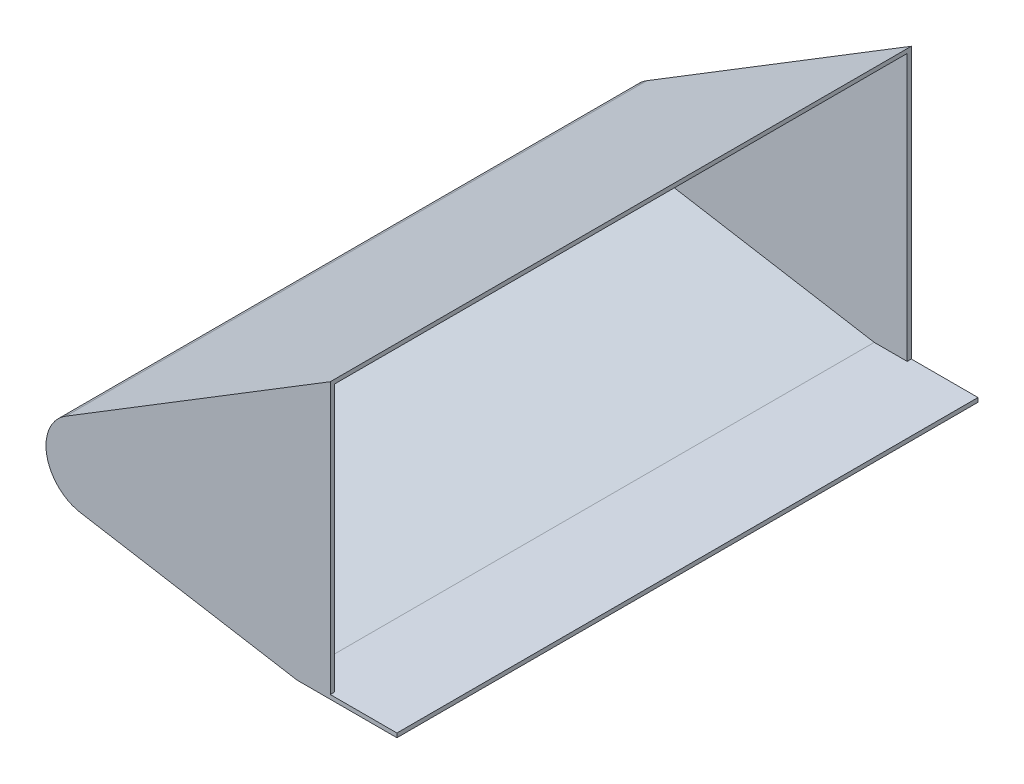
ISO-10303-21;
HEADER;
FILE_DESCRIPTION(('STEP AP214'),'2;1');
FILE_NAME('part.step','',(''),(''),'','','');
FILE_SCHEMA(('AUTOMOTIVE_DESIGN { 1 0 10303 214 1 1 1 1 }'));
ENDSEC;
DATA;
#1=APPLICATION_CONTEXT('core data for automotive mechanical design processes');
#2=APPLICATION_PROTOCOL_DEFINITION('international standard','automotive_design',2000,#1);
#3=PRODUCT_CONTEXT('',#1,'mechanical');
#4=PRODUCT('Part','Part','',(#3));
#5=PRODUCT_RELATED_PRODUCT_CATEGORY('part','',(#4));
#6=PRODUCT_DEFINITION_FORMATION('','',#4);
#7=PRODUCT_DEFINITION_CONTEXT('part definition',#1,'design');
#8=PRODUCT_DEFINITION('design','',#6,#7);
#9=PRODUCT_DEFINITION_SHAPE('','',#8);
#10=(LENGTH_UNIT() NAMED_UNIT(*) SI_UNIT(.MILLI.,.METRE.));
#11=(NAMED_UNIT(*) PLANE_ANGLE_UNIT() SI_UNIT($,.RADIAN.));
#12=(NAMED_UNIT(*) SI_UNIT($,.STERADIAN.) SOLID_ANGLE_UNIT());
#13=UNCERTAINTY_MEASURE_WITH_UNIT(LENGTH_MEASURE(1.E-05),#10,'distance_accuracy_value','');
#14=(GEOMETRIC_REPRESENTATION_CONTEXT(3) GLOBAL_UNCERTAINTY_ASSIGNED_CONTEXT((#13)) GLOBAL_UNIT_ASSIGNED_CONTEXT((#10,
#11,#12)) REPRESENTATION_CONTEXT('',''));
#15=CARTESIAN_POINT('',(0.,0.,0.));
#16=DIRECTION('',(0.,0.,1.));
#17=DIRECTION('',(1.,0.,0.));
#18=AXIS2_PLACEMENT_3D('',#15,#16,#17);
#19=CARTESIAN_POINT('',(0.,0.,700.));
#20=DIRECTION('',(0.,-1.,0.));
#21=DIRECTION('',(0.,0.,-1.));
#22=AXIS2_PLACEMENT_3D('',#19,#20,#21);
#23=PLANE('',#22);
#24=DIRECTION('',(0.,0.,-1.));
#25=VECTOR('',#24,1.);
#26=CARTESIAN_POINT('',(-80.2729691105272,0.,0.));
#27=LINE('',#26,#25);
#28=CARTESIAN_POINT('',(-80.2729691105272,0.,5.));
#29=VERTEX_POINT('',#28);
#30=CARTESIAN_POINT('',(-80.2729691105272,0.,0.));
#31=VERTEX_POINT('',#30);
#32=EDGE_CURVE('E692',#29,#31,#27,.T.);
#33=ORIENTED_EDGE('',*,*,#32,.F.);
#34=DIRECTION('',(1.,0.,0.));
#35=VECTOR('',#34,1.);
#36=CARTESIAN_POINT('',(0.,0.,5.));
#37=LINE('',#36,#35);
#38=CARTESIAN_POINT('',(-120.,0.,5.));
#39=VERTEX_POINT('',#38);
#40=EDGE_CURVE('E704',#39,#29,#37,.T.);
#41=ORIENTED_EDGE('',*,*,#40,.F.);
#42=DIRECTION('',(0.,0.,-1.));
#43=VECTOR('',#42,1.);
#44=CARTESIAN_POINT('',(-120.,0.,700.));
#45=LINE('',#44,#43);
#46=CARTESIAN_POINT('',(-120.,0.,695.));
#47=VERTEX_POINT('',#46);
#48=EDGE_CURVE('E439',#47,#39,#45,.T.);
#49=ORIENTED_EDGE('',*,*,#48,.F.);
#50=DIRECTION('',(1.,0.,0.));
#51=VECTOR('',#50,1.);
#52=CARTESIAN_POINT('',(0.,0.,695.));
#53=LINE('',#52,#51);
#54=CARTESIAN_POINT('',(-80.2729691105272,0.,695.));
#55=VERTEX_POINT('',#54);
#56=EDGE_CURVE('E571',#47,#55,#53,.T.);
#57=ORIENTED_EDGE('',*,*,#56,.T.);
#58=DIRECTION('',(0.,0.,1.));
#59=VECTOR('',#58,1.);
#60=CARTESIAN_POINT('',(-80.2729691105272,0.,700.));
#61=LINE('',#60,#59);
#62=CARTESIAN_POINT('',(-80.2729691105272,0.,700.));
#63=VERTEX_POINT('',#62);
#64=EDGE_CURVE('E419',#55,#63,#61,.T.);
#65=ORIENTED_EDGE('',*,*,#64,.T.);
#66=DIRECTION('',(-1.,0.,0.));
#67=VECTOR('',#66,1.);
#68=CARTESIAN_POINT('',(0.,0.,700.));
#69=LINE('',#68,#67);
#70=CARTESIAN_POINT('',(0.,0.,700.));
#71=VERTEX_POINT('',#70);
#72=EDGE_CURVE('E401',#71,#63,#69,.T.);
#73=ORIENTED_EDGE('',*,*,#72,.F.);
#74=DIRECTION('',(0.,0.,-1.));
#75=VECTOR('',#74,1.);
#76=CARTESIAN_POINT('',(0.,0.,700.));
#77=LINE('',#76,#75);
#78=CARTESIAN_POINT('',(0.,0.,0.));
#79=VERTEX_POINT('',#78);
#80=EDGE_CURVE('E442',#71,#79,#77,.T.);
#81=ORIENTED_EDGE('',*,*,#80,.T.);
#82=DIRECTION('',(-1.,0.,0.));
#83=VECTOR('',#82,1.);
#84=CARTESIAN_POINT('',(0.,0.,0.));
#85=LINE('',#84,#83);
#86=EDGE_CURVE('E418',#79,#31,#85,.T.);
#87=ORIENTED_EDGE('',*,*,#86,.T.);
#88=EDGE_LOOP('',(#33,#41,#49,#57,#65,#73,#81,#87));
#89=FACE_BOUND('',#88,.T.);
#90=ADVANCED_FACE('F37',(#89),#23,.F.);
#91=CARTESIAN_POINT('',(0.,0.,700.));
#92=DIRECTION('',(-1.,0.,0.));
#93=DIRECTION('',(0.,0.,1.));
#94=AXIS2_PLACEMENT_3D('',#91,#92,#93);
#95=PLANE('',#94);
#96=DIRECTION('',(0.,1.,0.));
#97=VECTOR('',#96,1.);
#98=CARTESIAN_POINT('',(0.,0.,0.));
#99=LINE('',#98,#97);
#100=CARTESIAN_POINT('',(0.,-5.,0.));
#101=VERTEX_POINT('',#100);
#102=EDGE_CURVE('E415',#101,#79,#99,.T.);
#103=ORIENTED_EDGE('',*,*,#102,.T.);
#104=ORIENTED_EDGE('',*,*,#80,.F.);
#105=DIRECTION('',(0.,1.,0.));
#106=VECTOR('',#105,1.);
#107=CARTESIAN_POINT('',(0.,0.,700.));
#108=LINE('',#107,#106);
#109=CARTESIAN_POINT('',(0.,-5.,700.));
#110=VERTEX_POINT('',#109);
#111=EDGE_CURVE('E398',#110,#71,#108,.T.);
#112=ORIENTED_EDGE('',*,*,#111,.F.);
#113=DIRECTION('',(0.,0.,-1.));
#114=VECTOR('',#113,1.);
#115=CARTESIAN_POINT('',(0.,-5.,700.));
#116=LINE('',#115,#114);
#117=EDGE_CURVE('E414',#110,#101,#116,.T.);
#118=ORIENTED_EDGE('',*,*,#117,.T.);
#119=EDGE_LOOP('',(#103,#104,#112,#118));
#120=FACE_BOUND('',#119,.T.);
#121=ADVANCED_FACE('F544',(#120),#95,.F.);
#122=CARTESIAN_POINT('',(-120.,0.,700.));
#123=DIRECTION('',(-0.16711291409415,-0.985937763726981,0.));
#124=DIRECTION('',(0.985937763726982,-0.16711291409415,0.));
#125=AXIS2_PLACEMENT_3D('',#122,#123,#124);
#126=PLANE('',#125);
#127=ORIENTED_EDGE('',*,*,#48,.T.);
#128=DIRECTION('',(0.985937763726982,-0.16711291409415,0.));
#129=VECTOR('',#128,1.);
#130=CARTESIAN_POINT('',(-120.,0.,5.));
#131=LINE('',#130,#129);
#132=CARTESIAN_POINT('',(-368.673404444376,42.149249986453,5.));
#133=VERTEX_POINT('',#132);
#134=EDGE_CURVE('E566',#133,#39,#131,.T.);
#135=ORIENTED_EDGE('',*,*,#134,.F.);
#136=DIRECTION('',(0.,0.,-1.));
#137=VECTOR('',#136,1.);
#138=CARTESIAN_POINT('',(-368.673404444376,42.149249986453,700.));
#139=LINE('',#138,#137);
#140=CARTESIAN_POINT('',(-368.673404444376,42.149249986453,695.));
#141=VERTEX_POINT('',#140);
#142=EDGE_CURVE('E448',#133,#141,#139,.F.);
#143=ORIENTED_EDGE('',*,*,#142,.T.);
#144=DIRECTION('',(0.985937763726982,-0.16711291409415,0.));
#145=VECTOR('',#144,1.);
#146=CARTESIAN_POINT('',(-120.,0.,695.));
#147=LINE('',#146,#145);
#148=EDGE_CURVE('E564',#141,#47,#147,.T.);
#149=ORIENTED_EDGE('',*,*,#148,.T.);
#150=EDGE_LOOP('',(#127,#135,#143,#149));
#151=FACE_BOUND('',#150,.T.);
#152=ADVANCED_FACE('F540',(#151),#126,.F.);
#153=CARTESIAN_POINT('',(-80.2729691105272,321.336979592381,700.));
#154=DIRECTION('',(-0.521764614941752,0.853089495067596,0.));
#155=DIRECTION('',(-0.853089495067596,-0.521764614941752,0.));
#156=AXIS2_PLACEMENT_3D('',#153,#154,#155);
#157=PLANE('',#156);
#158=DIRECTION('',(0.,0.,-1.));
#159=VECTOR('',#158,1.);
#160=CARTESIAN_POINT('',(-386.405989486756,134.100612926182,0.));
#161=LINE('',#160,#159);
#162=CARTESIAN_POINT('',(-386.405989486756,134.100612926182,695.));
#163=VERTEX_POINT('',#162);
#164=CARTESIAN_POINT('',(-386.405989486756,134.100612926182,5.));
#165=VERTEX_POINT('',#164);
#166=EDGE_CURVE('E445',#163,#165,#161,.T.);
#167=ORIENTED_EDGE('',*,*,#166,.T.);
#168=DIRECTION('',(-0.853089495067596,-0.521764614941752,0.));
#169=VECTOR('',#168,1.);
#170=CARTESIAN_POINT('',(-80.2729691105272,321.336979592381,5.));
#171=LINE('',#170,#169);
#172=CARTESIAN_POINT('',(-80.2729691105272,321.336979592381,5.));
#173=VERTEX_POINT('',#172);
#174=EDGE_CURVE('E56',#173,#165,#171,.T.);
#175=ORIENTED_EDGE('',*,*,#174,.F.);
#176=DIRECTION('',(0.,0.,-1.));
#177=VECTOR('',#176,1.);
#178=CARTESIAN_POINT('',(-80.2729691105272,321.336979592381,700.));
#179=LINE('',#178,#177);
#180=CARTESIAN_POINT('',(-80.2729691105272,321.336979592381,695.));
#181=VERTEX_POINT('',#180);
#182=EDGE_CURVE('E436',#181,#173,#179,.T.);
#183=ORIENTED_EDGE('',*,*,#182,.F.);
#184=DIRECTION('',(-0.853089495067596,-0.521764614941752,0.));
#185=VECTOR('',#184,1.);
#186=CARTESIAN_POINT('',(-80.2729691105272,321.336979592381,695.));
#187=LINE('',#186,#185);
#188=EDGE_CURVE('E572',#181,#163,#187,.T.);
#189=ORIENTED_EDGE('',*,*,#188,.T.);
#190=EDGE_LOOP('',(#167,#175,#183,#189));
#191=FACE_BOUND('',#190,.T.);
#192=ADVANCED_FACE('F536',(#191),#157,.F.);
#193=CARTESIAN_POINT('',(-80.2729691105272,326.336979592381,700.));
#194=DIRECTION('',(-1.,0.,0.));
#195=DIRECTION('',(0.,-1.,0.));
#196=AXIS2_PLACEMENT_3D('',#193,#194,#195);
#197=PLANE('',#196);
#198=DIRECTION('',(0.,0.,-1.));
#199=VECTOR('',#198,1.);
#200=CARTESIAN_POINT('',(-80.2729691105272,326.336979592381,700.));
#201=LINE('',#200,#199);
#202=CARTESIAN_POINT('',(-80.2729691105272,326.336979592381,700.));
#203=VERTEX_POINT('',#202);
#204=CARTESIAN_POINT('',(-80.2729691105272,326.336979592381,0.));
#205=VERTEX_POINT('',#204);
#206=EDGE_CURVE('E434',#203,#205,#201,.T.);
#207=ORIENTED_EDGE('',*,*,#206,.F.);
#208=DIRECTION('',(0.,1.,0.));
#209=VECTOR('',#208,1.);
#210=CARTESIAN_POINT('',(-80.2729691105272,326.336979592381,700.));
#211=LINE('',#210,#209);
#212=EDGE_CURVE('E405',#63,#203,#211,.T.);
#213=ORIENTED_EDGE('',*,*,#212,.F.);
#214=ORIENTED_EDGE('',*,*,#64,.F.);
#215=DIRECTION('',(0.,1.,0.));
#216=VECTOR('',#215,1.);
#217=CARTESIAN_POINT('',(-80.2729691105272,-5.00000000000001,695.));
#218=LINE('',#217,#216);
#219=EDGE_CURVE('E285',#55,#181,#218,.T.);
#220=ORIENTED_EDGE('',*,*,#219,.T.);
#221=ORIENTED_EDGE('',*,*,#182,.T.);
#222=DIRECTION('',(0.,1.,0.));
#223=VECTOR('',#222,1.);
#224=CARTESIAN_POINT('',(-80.2729691105272,-5.00000000000001,5.));
#225=LINE('',#224,#223);
#226=EDGE_CURVE('E670',#29,#173,#225,.T.);
#227=ORIENTED_EDGE('',*,*,#226,.F.);
#228=ORIENTED_EDGE('',*,*,#32,.T.);
#229=DIRECTION('',(0.,1.,0.));
#230=VECTOR('',#229,1.);
#231=CARTESIAN_POINT('',(-80.2729691105272,326.336979592381,0.));
#232=LINE('',#231,#230);
#233=EDGE_CURVE('E422',#31,#205,#232,.T.);
#234=ORIENTED_EDGE('',*,*,#233,.T.);
#235=EDGE_LOOP('',(#207,#213,#214,#220,#221,#227,#228,#234));
#236=FACE_BOUND('',#235,.T.);
#237=ADVANCED_FACE('F533',(#236),#197,.F.);
#238=CARTESIAN_POINT('',(-506.593051287573,65.0876972344056,700.));
#239=DIRECTION('',(0.522498564715955,-0.852640164354089,0.));
#240=DIRECTION('',(0.852640164354089,0.522498564715955,0.));
#241=AXIS2_PLACEMENT_3D('',#238,#239,#240);
#242=PLANE('',#241);
#243=DIRECTION('',(0.,0.,-1.));
#244=VECTOR('',#243,1.);
#245=CARTESIAN_POINT('',(-398.853702629337,131.110455005856,5.));
#246=LINE('',#245,#244);
#247=CARTESIAN_POINT('',(-398.853702629337,131.110455005856,5.));
#248=VERTEX_POINT('',#247);
#249=CARTESIAN_POINT('',(-398.853702629337,131.110455005856,0.));
#250=VERTEX_POINT('',#249);
#251=EDGE_CURVE('E218',#248,#250,#246,.T.);
#252=ORIENTED_EDGE('',*,*,#251,.F.);
#253=DIRECTION('',(0.,0.,-1.));
#254=VECTOR('',#253,1.);
#255=CARTESIAN_POINT('',(-398.853702629337,131.110455005857,700.));
#256=LINE('',#255,#254);
#257=CARTESIAN_POINT('',(-398.853702629337,131.110455005856,695.));
#258=VERTEX_POINT('',#257);
#259=EDGE_CURVE('E232',#248,#258,#256,.F.);
#260=ORIENTED_EDGE('',*,*,#259,.T.);
#261=DIRECTION('',(0.,0.,1.));
#262=VECTOR('',#261,1.);
#263=CARTESIAN_POINT('',(-398.853702629337,131.110455005856,695.));
#264=LINE('',#263,#262);
#265=CARTESIAN_POINT('',(-398.853702629337,131.110455005856,700.));
#266=VERTEX_POINT('',#265);
#267=EDGE_CURVE('E296',#258,#266,#264,.T.);
#268=ORIENTED_EDGE('',*,*,#267,.T.);
#269=DIRECTION('',(-0.852640164354091,-0.52249856471595,0.));
#270=VECTOR('',#269,1.);
#271=CARTESIAN_POINT('',(-506.593051287573,65.0876972344056,700.));
#272=LINE('',#271,#270);
#273=EDGE_CURVE('E407',#203,#266,#272,.T.);
#274=ORIENTED_EDGE('',*,*,#273,.F.);
#275=ORIENTED_EDGE('',*,*,#206,.T.);
#276=DIRECTION('',(-0.852640164354089,-0.522498564715955,0.));
#277=VECTOR('',#276,1.);
#278=CARTESIAN_POINT('',(-506.593051287573,65.0876972344056,0.));
#279=LINE('',#278,#277);
#280=EDGE_CURVE('E243',#205,#250,#279,.T.);
#281=ORIENTED_EDGE('',*,*,#280,.T.);
#282=EDGE_LOOP('',(#252,#260,#268,#274,#275,#281));
#283=FACE_BOUND('',#282,.T.);
#284=ADVANCED_FACE('F241',(#283),#242,.F.);
#285=CARTESIAN_POINT('',(-120.42074056183,-5.00000000000002,700.));
#286=DIRECTION('',(0.16711291409415,0.985937763726981,0.));
#287=DIRECTION('',(-0.985937763726982,0.16711291409415,0.));
#288=AXIS2_PLACEMENT_3D('',#285,#286,#287);
#289=PLANE('',#288);
#290=DIRECTION('',(0.985937763726981,-0.16711291409415,0.));
#291=VECTOR('',#290,1.);
#292=CARTESIAN_POINT('',(-120.42074056183,-5.00000000000002,0.));
#293=LINE('',#292,#291);
#294=CARTESIAN_POINT('',(-381.084420098247,39.1815586018033,0.));
#295=VERTEX_POINT('',#294);
#296=CARTESIAN_POINT('',(-120.42074056183,-5.00000000000002,0.));
#297=VERTEX_POINT('',#296);
#298=EDGE_CURVE('E426',#295,#297,#293,.T.);
#299=ORIENTED_EDGE('',*,*,#298,.T.);
#300=DIRECTION('',(0.,0.,-1.));
#301=VECTOR('',#300,1.);
#302=CARTESIAN_POINT('',(-120.42074056183,-5.00000000000002,700.));
#303=LINE('',#302,#301);
#304=CARTESIAN_POINT('',(-120.42074056183,-5.00000000000002,700.));
#305=VERTEX_POINT('',#304);
#306=EDGE_CURVE('E432',#305,#297,#303,.T.);
#307=ORIENTED_EDGE('',*,*,#306,.F.);
#308=DIRECTION('',(0.985937763726982,-0.167112914094148,0.));
#309=VECTOR('',#308,1.);
#310=CARTESIAN_POINT('',(-505.351292423994,60.2443476780838,700.));
#311=LINE('',#310,#309);
#312=CARTESIAN_POINT('',(-381.084420098247,39.1815586018033,700.));
#313=VERTEX_POINT('',#312);
#314=EDGE_CURVE('E410',#313,#305,#311,.T.);
#315=ORIENTED_EDGE('',*,*,#314,.F.);
#316=DIRECTION('',(0.,0.,-1.));
#317=VECTOR('',#316,1.);
#318=CARTESIAN_POINT('',(-381.084420098247,39.181558601803,700.));
#319=LINE('',#318,#317);
#320=CARTESIAN_POINT('',(-381.084420098247,39.1815586018033,695.));
#321=VERTEX_POINT('',#320);
#322=EDGE_CURVE('E451',#313,#321,#319,.T.);
#323=ORIENTED_EDGE('',*,*,#322,.T.);
#324=CARTESIAN_POINT('',(-381.084420098247,39.1815586018033,5.));
#325=VERTEX_POINT('',#324);
#326=EDGE_CURVE('E450',#321,#325,#319,.T.);
#327=ORIENTED_EDGE('',*,*,#326,.T.);
#328=DIRECTION('',(0.,0.,1.));
#329=VECTOR('',#328,1.);
#330=CARTESIAN_POINT('',(-381.084420098247,39.181558601803,0.));
#331=LINE('',#330,#329);
#332=EDGE_CURVE('E642',#295,#325,#331,.T.);
#333=ORIENTED_EDGE('',*,*,#332,.F.);
#334=EDGE_LOOP('',(#299,#307,#315,#323,#327,#333));
#335=FACE_BOUND('',#334,.T.);
#336=ADVANCED_FACE('F526',(#335),#289,.F.);
#337=CARTESIAN_POINT('',(0.,-5.,700.));
#338=DIRECTION('',(0.,1.,0.));
#339=DIRECTION('',(-1.,0.,0.));
#340=AXIS2_PLACEMENT_3D('',#337,#338,#339);
#341=PLANE('',#340);
#342=ORIENTED_EDGE('',*,*,#117,.F.);
#343=DIRECTION('',(1.,0.,0.));
#344=VECTOR('',#343,1.);
#345=CARTESIAN_POINT('',(0.,-5.,700.));
#346=LINE('',#345,#344);
#347=EDGE_CURVE('E412',#305,#110,#346,.T.);
#348=ORIENTED_EDGE('',*,*,#347,.F.);
#349=ORIENTED_EDGE('',*,*,#306,.T.);
#350=DIRECTION('',(1.,0.,0.));
#351=VECTOR('',#350,1.);
#352=CARTESIAN_POINT('',(0.,-5.,0.));
#353=LINE('',#352,#351);
#354=EDGE_CURVE('E402',#297,#101,#353,.T.);
#355=ORIENTED_EDGE('',*,*,#354,.T.);
#356=EDGE_LOOP('',(#342,#348,#349,#355));
#357=FACE_BOUND('',#356,.T.);
#358=ADVANCED_FACE('F522',(#357),#341,.F.);
#359=CARTESIAN_POINT('',(0.,0.,700.));
#360=DIRECTION('',(0.,0.,-1.));
#361=DIRECTION('',(-1.,0.,0.));
#362=AXIS2_PLACEMENT_3D('',#359,#360,#361);
#363=PLANE('',#362);
#364=ORIENTED_EDGE('',*,*,#212,.T.);
#365=ORIENTED_EDGE('',*,*,#273,.T.);
#366=CARTESIAN_POINT('',(-398.853702629337,131.110455005856,700.));
#367=CARTESIAN_POINT('',(-406.706116268335,126.337398714226,700.));
#368=CARTESIAN_POINT('',(-417.396955451159,114.668240542963,700.));
#369=CARTESIAN_POINT('',(-424.220724955013,91.7130605716426,700.));
#370=CARTESIAN_POINT('',(-421.112435821776,70.320363039418,700.));
#371=CARTESIAN_POINT('',(-406.882601787303,49.048758298305,700.));
#372=CARTESIAN_POINT('',(-391.360070335066,40.8761515593173,700.));
#373=CARTESIAN_POINT('',(-381.084420098247,39.1815586018033,700.));
#374=B_SPLINE_CURVE_WITH_KNOTS('',3,(#366,#367,#368,#369,#370,#371,#372,#373),.UNSPECIFIED.,.F.,
.F.,(4,1,1,1,1,4),(0.,0.228119284881033,0.378356265084678,0.583675290987883,0.742972738792849,
1.),.UNSPECIFIED.);
#375=CARTESIAN_POINT('',(-408.589752948626,123.320809180384,700.));
#376=VERTEX_POINT('',#375);
#377=EDGE_CURVE('E289',#266,#376,#374,.T.);
#378=ORIENTED_EDGE('',*,*,#377,.T.);
#379=CARTESIAN_POINT('',(-408.589752948626,123.320809180384,700.));
#380=CARTESIAN_POINT('',(-411.214864087282,120.61223574668,700.));
#381=CARTESIAN_POINT('',(-413.41133545975,117.538236168163,700.));
#382=CARTESIAN_POINT('',(-415.613873186251,114.455746622522,700.));
#383=CARTESIAN_POINT('',(-417.319283339179,111.098935553182,700.));
#384=B_SPLINE_CURVE_WITH_KNOTS('',2,(#379,#380,#381,#382,#383),.UNSPECIFIED.,.F.,.F.,(3,2,3),
(0.,0.5,1.),.UNSPECIFIED.);
#385=CARTESIAN_POINT('',(-417.319283339179,111.098935553182,700.));
#386=VERTEX_POINT('',#385);
#387=EDGE_CURVE('E49',#376,#386,#384,.T.);
#388=ORIENTED_EDGE('',*,*,#387,.T.);
#389=CARTESIAN_POINT('',(-422.451345579579,93.7382865812564,700.));
#390=CARTESIAN_POINT('',(-421.820332597906,99.7879872713271,700.));
#391=CARTESIAN_POINT('',(-420.063906482746,105.696609706046,700.));
#392=CARTESIAN_POINT('',(-417.319283338821,111.098935553885,700.));
#393=B_SPLINE_CURVE_WITH_KNOTS('',3,(#389,#390,#391,#392),.UNSPECIFIED.,.F.,.F.,(4,4),
(0.228119284881033,0.378356265084678),.UNSPECIFIED.);
#394=CARTESIAN_POINT('',(-422.451345579547,93.7382865815707,700.));
#395=VERTEX_POINT('',#394);
#396=EDGE_CURVE('E581',#386,#395,#393,.F.);
#397=ORIENTED_EDGE('',*,*,#396,.T.);
#398=CARTESIAN_POINT('',(-372.728774393539,88.4784467881521,700.));
#399=DIRECTION('',(0.,0.,-1.));
#400=DIRECTION('',(-1.,0.,0.));
#401=AXIS2_PLACEMENT_3D('',#398,#399,#400);
#402=CIRCLE('',#401,50.);
#403=CARTESIAN_POINT('',(-418.886048430871,69.2559065438806,700.));
#404=VERTEX_POINT('',#403);
#405=EDGE_CURVE('E590',#395,#404,#402,.F.);
#406=ORIENTED_EDGE('',*,*,#405,.T.);
#407=CARTESIAN_POINT('',(-408.242362450359,53.2820682339536,700.));
#408=CARTESIAN_POINT('',(-412.766124879209,57.8437995751773,700.));
#409=CARTESIAN_POINT('',(-416.412548251735,63.2946907458844,700.));
#410=CARTESIAN_POINT('',(-418.886048430996,69.2559065441812,700.));
#411=B_SPLINE_CURVE_WITH_KNOTS('',3,(#407,#408,#409,#410),.UNSPECIFIED.,.F.,.F.,(4,4),
(0.583675290987883,0.742972738792849),.UNSPECIFIED.);
#412=CARTESIAN_POINT('',(-408.242362451653,53.2820682352585,700.));
#413=VERTEX_POINT('',#412);
#414=EDGE_CURVE('E238',#404,#413,#411,.F.);
#415=ORIENTED_EDGE('',*,*,#414,.T.);
#416=CARTESIAN_POINT('',(-408.242362451654,53.2820682352588,700.));
#417=CARTESIAN_POINT('',(-405.736178995167,50.754849841063,700.));
#418=CARTESIAN_POINT('',(-402.881526839779,48.5974815908616,700.));
#419=CARTESIAN_POINT('',(-400.035361174107,46.446526900867,700.));
#420=CARTESIAN_POINT('',(-396.915520573526,44.7177188551652,700.));
#421=B_SPLINE_CURVE_WITH_KNOTS('',2,(#416,#417,#418,#419,#420),.UNSPECIFIED.,.F.,.F.,(3,2,3),
(0.,0.5,1.),.UNSPECIFIED.);
#422=CARTESIAN_POINT('',(-396.915520573533,44.7177188551693,700.));
#423=VERTEX_POINT('',#422);
#424=EDGE_CURVE('E11',#413,#423,#421,.T.);
#425=ORIENTED_EDGE('',*,*,#424,.T.);
#426=EDGE_CURVE('E396',#423,#313,#374,.T.);
#427=ORIENTED_EDGE('',*,*,#426,.T.);
#428=ORIENTED_EDGE('',*,*,#314,.T.);
#429=ORIENTED_EDGE('',*,*,#347,.T.);
#430=ORIENTED_EDGE('',*,*,#111,.T.);
#431=ORIENTED_EDGE('',*,*,#72,.T.);
#432=EDGE_LOOP('',(#364,#365,#378,#388,#397,#406,#415,#425,#427,#428,#429,#430,#431));
#433=FACE_BOUND('',#432,.T.);
#434=ADVANCED_FACE('F316',(#433),#363,.F.);
#435=CARTESIAN_POINT('',(0.,0.,0.));
#436=DIRECTION('',(0.,0.,-1.));
#437=DIRECTION('',(-1.,0.,0.));
#438=AXIS2_PLACEMENT_3D('',#435,#436,#437);
#439=PLANE('',#438);
#440=ORIENTED_EDGE('',*,*,#233,.F.);
#441=ORIENTED_EDGE('',*,*,#86,.F.);
#442=ORIENTED_EDGE('',*,*,#102,.F.);
#443=ORIENTED_EDGE('',*,*,#354,.F.);
#444=ORIENTED_EDGE('',*,*,#298,.F.);
#445=CARTESIAN_POINT('',(-398.853702629337,131.110455005856,0.));
#446=CARTESIAN_POINT('',(-406.706116268335,126.337398714226,0.));
#447=CARTESIAN_POINT('',(-417.396955451159,114.668240542963,0.));
#448=CARTESIAN_POINT('',(-424.220724955013,91.7130605716426,0.));
#449=CARTESIAN_POINT('',(-421.112435821776,70.320363039418,0.));
#450=CARTESIAN_POINT('',(-406.882601787303,49.048758298305,0.));
#451=CARTESIAN_POINT('',(-391.360070335066,40.8761515593173,0.));
#452=CARTESIAN_POINT('',(-381.084420098247,39.1815586018033,0.));
#453=B_SPLINE_CURVE_WITH_KNOTS('',3,(#445,#446,#447,#448,#449,#450,#451,#452),.UNSPECIFIED.,.F.,
.F.,(4,1,1,1,1,4),(0.,0.228119284881033,0.378356265084678,0.583675290987883,0.742972738792849,
1.),.UNSPECIFIED.);
#454=CARTESIAN_POINT('',(-396.915520573533,44.7177188551693,0.));
#455=VERTEX_POINT('',#454);
#456=EDGE_CURVE('E638',#455,#295,#453,.T.);
#457=ORIENTED_EDGE('',*,*,#456,.F.);
#458=CARTESIAN_POINT('',(-372.728774393539,88.4784467881521,0.));
#459=DIRECTION('',(0.,0.,-1.));
#460=DIRECTION('',(-1.,0.,0.));
#461=AXIS2_PLACEMENT_3D('',#458,#459,#460);
#462=CIRCLE('',#461,50.);
#463=CARTESIAN_POINT('',(-408.242362451653,53.2820682352585,0.));
#464=VERTEX_POINT('',#463);
#465=EDGE_CURVE('E239',#455,#464,#462,.T.);
#466=ORIENTED_EDGE('',*,*,#465,.T.);
#467=CARTESIAN_POINT('',(-418.886048430996,69.2559065441812,0.));
#468=CARTESIAN_POINT('',(-416.412548251735,63.2946907458844,0.));
#469=CARTESIAN_POINT('',(-412.766124879209,57.8437995751773,0.));
#470=CARTESIAN_POINT('',(-408.242362450359,53.2820682339536,0.));
#471=B_SPLINE_CURVE_WITH_KNOTS('',3,(#467,#468,#469,#470),.UNSPECIFIED.,.F.,.F.,(4,4),
(0.583675290987883,0.742972738792849),.UNSPECIFIED.);
#472=CARTESIAN_POINT('',(-418.886048430871,69.2559065438806,0.));
#473=VERTEX_POINT('',#472);
#474=EDGE_CURVE('E264',#464,#473,#471,.F.);
#475=ORIENTED_EDGE('',*,*,#474,.T.);
#476=CARTESIAN_POINT('',(-422.451345579547,93.7382865815707,0.));
#477=VERTEX_POINT('',#476);
#478=EDGE_CURVE('E259',#473,#477,#462,.T.);
#479=ORIENTED_EDGE('',*,*,#478,.T.);
#480=CARTESIAN_POINT('',(-417.319283338821,111.098935553885,0.));
#481=CARTESIAN_POINT('',(-420.063906482746,105.696609706046,0.));
#482=CARTESIAN_POINT('',(-421.820332597906,99.7879872713271,0.));
#483=CARTESIAN_POINT('',(-422.451345579579,93.7382865812564,0.));
#484=B_SPLINE_CURVE_WITH_KNOTS('',3,(#480,#481,#482,#483),.UNSPECIFIED.,.F.,.F.,(4,4),
(0.228119284881033,0.378356265084678),.UNSPECIFIED.);
#485=CARTESIAN_POINT('',(-417.319283339179,111.098935553182,0.));
#486=VERTEX_POINT('',#485);
#487=EDGE_CURVE('E255',#477,#486,#484,.F.);
#488=ORIENTED_EDGE('',*,*,#487,.T.);
#489=CARTESIAN_POINT('',(-408.589752948626,123.320809180384,0.));
#490=VERTEX_POINT('',#489);
#491=EDGE_CURVE('E257',#486,#490,#462,.T.);
#492=ORIENTED_EDGE('',*,*,#491,.T.);
#493=EDGE_CURVE('E719',#250,#490,#453,.T.);
#494=ORIENTED_EDGE('',*,*,#493,.F.);
#495=ORIENTED_EDGE('',*,*,#280,.F.);
#496=EDGE_LOOP('',(#440,#441,#442,#443,#444,#457,#466,#475,#479,#488,#492,#494,#495));
#497=FACE_BOUND('',#496,.T.);
#498=ADVANCED_FACE('F256',(#497),#439,.T.);
#499=CARTESIAN_POINT('',(-360.317758739669,91.4461381728021,700.));
#500=DIRECTION('',(0.,0.,1.));
#501=DIRECTION('',(1.,0.,0.));
#502=AXIS2_PLACEMENT_3D('',#499,#500,#501);
#503=CYLINDRICAL_SURFACE('',#502,50.);
#504=ORIENTED_EDGE('',*,*,#142,.F.);
#505=CARTESIAN_POINT('',(-360.317758739669,91.4461381728021,5.));
#506=DIRECTION('',(0.,0.,-1.));
#507=DIRECTION('',(-1.,0.,0.));
#508=AXIS2_PLACEMENT_3D('',#505,#506,#507);
#509=CIRCLE('',#508,50.);
#510=EDGE_CURVE('E244',#165,#133,#509,.F.);
#511=ORIENTED_EDGE('',*,*,#510,.F.);
#512=ORIENTED_EDGE('',*,*,#166,.F.);
#513=CARTESIAN_POINT('',(-360.317758739669,91.4461381728021,695.));
#514=DIRECTION('',(0.,0.,-1.));
#515=DIRECTION('',(-1.,0.,0.));
#516=AXIS2_PLACEMENT_3D('',#513,#514,#515);
#517=CIRCLE('',#516,50.);
#518=EDGE_CURVE('E560',#163,#141,#517,.F.);
#519=ORIENTED_EDGE('',*,*,#518,.T.);
#520=EDGE_LOOP('',(#504,#511,#512,#519));
#521=FACE_BOUND('',#520,.T.);
#522=ADVANCED_FACE('F521',(#521),#503,.F.);
#523=CARTESIAN_POINT('',(-372.728774393539,88.4784467881521,700.));
#524=DIRECTION('',(0.,0.,-1.));
#525=DIRECTION('',(-1.,0.,0.));
#526=AXIS2_PLACEMENT_3D('',#523,#524,#525);
#527=CYLINDRICAL_SURFACE('',#526,50.);
#528=CARTESIAN_POINT('',(-372.728774393539,88.4784467881521,5.));
#529=DIRECTION('',(0.,0.,-1.));
#530=DIRECTION('',(-1.,0.,0.));
#531=AXIS2_PLACEMENT_3D('',#528,#529,#530);
#532=CIRCLE('',#531,50.);
#533=CARTESIAN_POINT('',(-408.589752948625,123.320809180384,5.));
#534=VERTEX_POINT('',#533);
#535=EDGE_CURVE('E227',#248,#534,#532,.F.);
#536=ORIENTED_EDGE('',*,*,#535,.T.);
#537=CARTESIAN_POINT('',(-408.589752948626,123.320809180384,0.));
#538=DIRECTION('',(0.,0.,1.));
#539=VECTOR('',#538,1.);
#540=LINE('',#537,#539);
#541=EDGE_CURVE('E221',#534,#490,#540,.F.);
#542=ORIENTED_EDGE('',*,*,#541,.T.);
#543=ORIENTED_EDGE('',*,*,#491,.F.);
#544=DIRECTION('',(0.,0.,-1.));
#545=VECTOR('',#544,1.);
#546=CARTESIAN_POINT('',(-417.319283339179,111.098935553182,4.99999999999989));
#547=LINE('',#546,#545);
#548=CARTESIAN_POINT('',(-417.319283339179,111.098935553182,5.));
#549=VERTEX_POINT('',#548);
#550=EDGE_CURVE('E64',#486,#549,#547,.F.);
#551=ORIENTED_EDGE('',*,*,#550,.T.);
#552=CARTESIAN_POINT('',(-422.451345579579,93.7382865812564,5.));
#553=CARTESIAN_POINT('',(-421.820332597906,99.7879872713271,5.));
#554=CARTESIAN_POINT('',(-420.063906482746,105.696609706046,5.));
#555=CARTESIAN_POINT('',(-417.319283338821,111.098935553885,5.));
#556=B_SPLINE_CURVE_WITH_KNOTS('',3,(#552,#553,#554,#555),.UNSPECIFIED.,.F.,.F.,(4,4),
(0.228119284881033,0.378356265084678),.UNSPECIFIED.);
#557=CARTESIAN_POINT('',(-422.451345579547,93.7382865815707,5.));
#558=VERTEX_POINT('',#557);
#559=EDGE_CURVE('E263',#549,#558,#556,.F.);
#560=ORIENTED_EDGE('',*,*,#559,.T.);
#561=DIRECTION('',(0.,0.,-1.));
#562=VECTOR('',#561,1.);
#563=CARTESIAN_POINT('',(-422.451345579547,93.7382865815707,5.));
#564=LINE('',#563,#562);
#565=EDGE_CURVE('E267',#558,#477,#564,.T.);
#566=ORIENTED_EDGE('',*,*,#565,.T.);
#567=ORIENTED_EDGE('',*,*,#478,.F.);
#568=DIRECTION('',(0.,0.,-1.));
#569=VECTOR('',#568,1.);
#570=CARTESIAN_POINT('',(-418.886048430871,69.2559065438806,4.99999999999989));
#571=LINE('',#570,#569);
#572=CARTESIAN_POINT('',(-418.886048430871,69.2559065438806,5.));
#573=VERTEX_POINT('',#572);
#574=EDGE_CURVE('E283',#473,#573,#571,.F.);
#575=ORIENTED_EDGE('',*,*,#574,.T.);
#576=CARTESIAN_POINT('',(-408.242362450359,53.2820682339536,5.));
#577=CARTESIAN_POINT('',(-412.766124879209,57.8437995751773,5.));
#578=CARTESIAN_POINT('',(-416.412548251735,63.2946907458844,5.));
#579=CARTESIAN_POINT('',(-418.886048430996,69.2559065441812,5.));
#580=B_SPLINE_CURVE_WITH_KNOTS('',3,(#576,#577,#578,#579),.UNSPECIFIED.,.F.,.F.,(4,4),
(0.583675290987883,0.742972738792849),.UNSPECIFIED.);
#581=CARTESIAN_POINT('',(-408.242362451653,53.2820682352584,5.));
#582=VERTEX_POINT('',#581);
#583=EDGE_CURVE('E284',#573,#582,#580,.F.);
#584=ORIENTED_EDGE('',*,*,#583,.T.);
#585=DIRECTION('',(0.,0.,-1.));
#586=VECTOR('',#585,1.);
#587=CARTESIAN_POINT('',(-408.242362451653,53.2820682352584,5.));
#588=LINE('',#587,#586);
#589=EDGE_CURVE('E281',#582,#464,#588,.T.);
#590=ORIENTED_EDGE('',*,*,#589,.T.);
#591=ORIENTED_EDGE('',*,*,#465,.F.);
#592=CARTESIAN_POINT('',(-396.915520573533,44.7177188551693,5.));
#593=DIRECTION('',(0.,0.,-1.));
#594=VECTOR('',#593,1.);
#595=LINE('',#592,#594);
#596=CARTESIAN_POINT('',(-396.915520573533,44.7177188551693,5.00000000000023));
#597=VERTEX_POINT('',#596);
#598=EDGE_CURVE('E466',#455,#597,#595,.F.);
#599=ORIENTED_EDGE('',*,*,#598,.T.);
#600=EDGE_CURVE('E511',#597,#325,#532,.F.);
#601=ORIENTED_EDGE('',*,*,#600,.T.);
#602=ORIENTED_EDGE('',*,*,#326,.F.);
#603=CARTESIAN_POINT('',(-372.728774393539,88.4784467881521,695.));
#604=DIRECTION('',(0.,0.,-1.));
#605=DIRECTION('',(-1.,0.,0.));
#606=AXIS2_PLACEMENT_3D('',#603,#604,#605);
#607=CIRCLE('',#606,50.);
#608=CARTESIAN_POINT('',(-396.915520573533,44.7177188551693,695.));
#609=VERTEX_POINT('',#608);
#610=EDGE_CURVE('E361',#609,#321,#607,.F.);
#611=ORIENTED_EDGE('',*,*,#610,.F.);
#612=DIRECTION('',(0.,0.,1.));
#613=VECTOR('',#612,1.);
#614=CARTESIAN_POINT('',(-396.915520573533,44.7177188551693,695.));
#615=LINE('',#614,#613);
#616=EDGE_CURVE('E386',#423,#609,#615,.F.);
#617=ORIENTED_EDGE('',*,*,#616,.F.);
#618=ORIENTED_EDGE('',*,*,#424,.F.);
#619=DIRECTION('',(0.,0.,1.));
#620=VECTOR('',#619,1.);
#621=CARTESIAN_POINT('',(-408.242362451653,53.2820682352584,695.));
#622=LINE('',#621,#620);
#623=CARTESIAN_POINT('',(-408.242362451653,53.2820682352584,695.));
#624=VERTEX_POINT('',#623);
#625=EDGE_CURVE('E610',#624,#413,#622,.T.);
#626=ORIENTED_EDGE('',*,*,#625,.F.);
#627=CARTESIAN_POINT('',(-418.886048430996,69.2559065441812,695.));
#628=CARTESIAN_POINT('',(-416.412548251735,63.2946907458844,695.));
#629=CARTESIAN_POINT('',(-412.766124879209,57.8437995751773,695.));
#630=CARTESIAN_POINT('',(-408.242362450359,53.2820682339536,695.));
#631=B_SPLINE_CURVE_WITH_KNOTS('',3,(#627,#628,#629,#630),.UNSPECIFIED.,.F.,.F.,(4,4),
(0.583675290987883,0.742972738792849),.UNSPECIFIED.);
#632=CARTESIAN_POINT('',(-418.886048430871,69.2559065438806,695.));
#633=VERTEX_POINT('',#632);
#634=EDGE_CURVE('E343',#633,#624,#631,.T.);
#635=ORIENTED_EDGE('',*,*,#634,.F.);
#636=DIRECTION('',(0.,0.,1.));
#637=VECTOR('',#636,1.);
#638=CARTESIAN_POINT('',(-418.886048430871,69.2559065438806,695.));
#639=LINE('',#638,#637);
#640=EDGE_CURVE('E591',#404,#633,#639,.F.);
#641=ORIENTED_EDGE('',*,*,#640,.F.);
#642=ORIENTED_EDGE('',*,*,#405,.F.);
#643=DIRECTION('',(0.,0.,1.));
#644=VECTOR('',#643,1.);
#645=CARTESIAN_POINT('',(-422.451345579547,93.7382865815707,695.));
#646=LINE('',#645,#644);
#647=CARTESIAN_POINT('',(-422.451345579547,93.7382865815707,695.));
#648=VERTEX_POINT('',#647);
#649=EDGE_CURVE('E585',#648,#395,#646,.T.);
#650=ORIENTED_EDGE('',*,*,#649,.F.);
#651=CARTESIAN_POINT('',(-417.319283338821,111.098935553885,695.));
#652=CARTESIAN_POINT('',(-420.063906482746,105.696609706046,695.));
#653=CARTESIAN_POINT('',(-421.820332597906,99.7879872713271,695.));
#654=CARTESIAN_POINT('',(-422.451345579579,93.7382865812564,695.));
#655=B_SPLINE_CURVE_WITH_KNOTS('',3,(#651,#652,#653,#654),.UNSPECIFIED.,.F.,.F.,(4,4),
(0.228119284881033,0.378356265084678),.UNSPECIFIED.);
#656=CARTESIAN_POINT('',(-417.319283339179,111.098935553182,695.));
#657=VERTEX_POINT('',#656);
#658=EDGE_CURVE('E589',#657,#648,#655,.T.);
#659=ORIENTED_EDGE('',*,*,#658,.F.);
#660=DIRECTION('',(0.,0.,1.));
#661=VECTOR('',#660,1.);
#662=CARTESIAN_POINT('',(-417.319283339179,111.098935553182,695.));
#663=LINE('',#662,#661);
#664=EDGE_CURVE('E582',#386,#657,#663,.F.);
#665=ORIENTED_EDGE('',*,*,#664,.F.);
#666=ORIENTED_EDGE('',*,*,#387,.F.);
#667=DIRECTION('',(0.,0.,1.));
#668=VECTOR('',#667,1.);
#669=CARTESIAN_POINT('',(-408.589752948625,123.320809180384,695.));
#670=LINE('',#669,#668);
#671=CARTESIAN_POINT('',(-408.589752948625,123.320809180384,695.));
#672=VERTEX_POINT('',#671);
#673=EDGE_CURVE('E357',#672,#376,#670,.T.);
#674=ORIENTED_EDGE('',*,*,#673,.F.);
#675=EDGE_CURVE('E234',#258,#672,#607,.F.);
#676=ORIENTED_EDGE('',*,*,#675,.F.);
#677=ORIENTED_EDGE('',*,*,#259,.F.);
#678=EDGE_LOOP('',(#536,#542,#543,#551,#560,#566,#567,#575,#584,#590,#591,#599,#601,#602,#611,
#617,#618,#626,#635,#641,#642,#650,#659,#665,#666,#674,#676,#677));
#679=FACE_BOUND('',#678,.T.);
#680=ADVANCED_FACE('F39',(#679),#527,.T.);
#681=CARTESIAN_POINT('',(-398.853702629337,131.110455005856,695.));
#682=CARTESIAN_POINT('',(-406.706116268335,126.337398714226,695.));
#683=CARTESIAN_POINT('',(-417.396955451159,114.668240542963,695.));
#684=CARTESIAN_POINT('',(-424.220724955013,91.7130605716426,695.));
#685=CARTESIAN_POINT('',(-421.112435821776,70.320363039418,695.));
#686=CARTESIAN_POINT('',(-406.882601787303,49.048758298305,695.));
#687=CARTESIAN_POINT('',(-391.360070335066,40.8761515593173,695.));
#688=CARTESIAN_POINT('',(-381.084420098247,39.1815586018033,695.));
#689=B_SPLINE_CURVE_WITH_KNOTS('',3,(#681,#682,#683,#684,#685,#686,#687,#688),.UNSPECIFIED.,.F.,
.F.,(4,1,1,1,1,4),(0.,0.228119284881033,0.378356265084678,0.583675290987883,0.742972738792849,
1.),.UNSPECIFIED.);
#690=DIRECTION('',(0.,0.,1.));
#691=VECTOR('',#690,1.);
#692=SURFACE_OF_LINEAR_EXTRUSION('',#689,#691);
#693=ORIENTED_EDGE('',*,*,#396,.F.);
#694=ORIENTED_EDGE('',*,*,#664,.T.);
#695=ORIENTED_EDGE('',*,*,#658,.T.);
#696=ORIENTED_EDGE('',*,*,#649,.T.);
#697=EDGE_LOOP('',(#693,#694,#695,#696));
#698=FACE_BOUND('',#697,.T.);
#699=ADVANCED_FACE('F556',(#698),#692,.T.);
#700=CARTESIAN_POINT('',(-421.802600588886,78.9969770450013,695.));
#701=DIRECTION('',(0.,0.,-1.));
#702=DIRECTION('',(-1.,0.,0.));
#703=AXIS2_PLACEMENT_3D('',#700,#701,#702);
#704=PLANE('',#703);
#705=EDGE_CURVE('E290',#258,#672,#689,.T.);
#706=ORIENTED_EDGE('',*,*,#705,.F.);
#707=ORIENTED_EDGE('',*,*,#675,.T.);
#708=EDGE_LOOP('',(#706,#707));
#709=FACE_BOUND('',#708,.T.);
#710=ADVANCED_FACE('F749',(#709),#704,.T.);
#711=ORIENTED_EDGE('',*,*,#705,.T.);
#712=ORIENTED_EDGE('',*,*,#673,.T.);
#713=ORIENTED_EDGE('',*,*,#377,.F.);
#714=ORIENTED_EDGE('',*,*,#267,.F.);
#715=EDGE_LOOP('',(#711,#712,#713,#714));
#716=FACE_BOUND('',#715,.T.);
#717=ADVANCED_FACE('F313',(#716),#692,.T.);
#718=EDGE_CURVE('E288',#609,#321,#689,.T.);
#719=ORIENTED_EDGE('',*,*,#718,.F.);
#720=ORIENTED_EDGE('',*,*,#610,.T.);
#721=EDGE_LOOP('',(#719,#720));
#722=FACE_BOUND('',#721,.T.);
#723=ADVANCED_FACE('F311',(#722),#704,.T.);
#724=ORIENTED_EDGE('',*,*,#426,.F.);
#725=ORIENTED_EDGE('',*,*,#616,.T.);
#726=ORIENTED_EDGE('',*,*,#718,.T.);
#727=ORIENTED_EDGE('',*,*,#322,.F.);
#728=EDGE_LOOP('',(#724,#725,#726,#727));
#729=FACE_BOUND('',#728,.T.);
#730=ADVANCED_FACE('F305',(#729),#692,.T.);
#731=ORIENTED_EDGE('',*,*,#414,.F.);
#732=ORIENTED_EDGE('',*,*,#640,.T.);
#733=ORIENTED_EDGE('',*,*,#634,.T.);
#734=ORIENTED_EDGE('',*,*,#625,.T.);
#735=EDGE_LOOP('',(#731,#732,#733,#734));
#736=FACE_BOUND('',#735,.T.);
#737=ADVANCED_FACE('F310',(#736),#692,.T.);
#738=ORIENTED_EDGE('',*,*,#56,.F.);
#739=ORIENTED_EDGE('',*,*,#148,.F.);
#740=ORIENTED_EDGE('',*,*,#518,.F.);
#741=ORIENTED_EDGE('',*,*,#188,.F.);
#742=ORIENTED_EDGE('',*,*,#219,.F.);
#743=EDGE_LOOP('',(#738,#739,#740,#741,#742));
#744=FACE_BOUND('',#743,.T.);
#745=ADVANCED_FACE('F314',(#744),#704,.T.);
#746=CARTESIAN_POINT('',(-398.853702629337,131.110455005856,5.));
#747=CARTESIAN_POINT('',(-406.706116268335,126.337398714226,5.));
#748=CARTESIAN_POINT('',(-417.396955451159,114.668240542963,5.));
#749=CARTESIAN_POINT('',(-424.220724955013,91.7130605716426,5.));
#750=CARTESIAN_POINT('',(-421.112435821776,70.320363039418,5.));
#751=CARTESIAN_POINT('',(-406.882601787303,49.048758298305,5.));
#752=CARTESIAN_POINT('',(-391.360070335066,40.8761515593173,5.));
#753=CARTESIAN_POINT('',(-381.084420098247,39.1815586018033,5.));
#754=B_SPLINE_CURVE_WITH_KNOTS('',3,(#746,#747,#748,#749,#750,#751,#752,#753),.UNSPECIFIED.,.F.,
.F.,(4,1,1,1,1,4),(0.,0.228119284881033,0.378356265084678,0.583675290987883,0.742972738792849,
1.),.UNSPECIFIED.);
#755=DIRECTION('',(0.,0.,-1.));
#756=VECTOR('',#755,1.);
#757=SURFACE_OF_LINEAR_EXTRUSION('',#754,#756);
#758=ORIENTED_EDGE('',*,*,#474,.F.);
#759=ORIENTED_EDGE('',*,*,#589,.F.);
#760=ORIENTED_EDGE('',*,*,#583,.F.);
#761=ORIENTED_EDGE('',*,*,#574,.F.);
#762=EDGE_LOOP('',(#758,#759,#760,#761));
#763=FACE_BOUND('',#762,.T.);
#764=ADVANCED_FACE('F641',(#763),#757,.F.);
#765=ORIENTED_EDGE('',*,*,#456,.T.);
#766=ORIENTED_EDGE('',*,*,#332,.T.);
#767=EDGE_CURVE('E225',#597,#325,#754,.T.);
#768=ORIENTED_EDGE('',*,*,#767,.F.);
#769=ORIENTED_EDGE('',*,*,#598,.F.);
#770=EDGE_LOOP('',(#765,#766,#768,#769));
#771=FACE_BOUND('',#770,.T.);
#772=ADVANCED_FACE('F650',(#771),#757,.F.);
#773=CARTESIAN_POINT('',(-421.802600588886,78.9969770450013,5.));
#774=DIRECTION('',(0.,0.,1.));
#775=DIRECTION('',(-1.,0.,0.));
#776=AXIS2_PLACEMENT_3D('',#773,#774,#775);
#777=PLANE('',#776);
#778=ORIENTED_EDGE('',*,*,#767,.T.);
#779=ORIENTED_EDGE('',*,*,#600,.F.);
#780=EDGE_LOOP('',(#778,#779));
#781=FACE_BOUND('',#780,.T.);
#782=ADVANCED_FACE('F660',(#781),#777,.T.);
#783=EDGE_CURVE('E214',#248,#534,#754,.T.);
#784=ORIENTED_EDGE('',*,*,#783,.F.);
#785=ORIENTED_EDGE('',*,*,#251,.T.);
#786=ORIENTED_EDGE('',*,*,#493,.T.);
#787=ORIENTED_EDGE('',*,*,#541,.F.);
#788=EDGE_LOOP('',(#784,#785,#786,#787));
#789=FACE_BOUND('',#788,.T.);
#790=ADVANCED_FACE('F216',(#789),#757,.F.);
#791=ORIENTED_EDGE('',*,*,#783,.T.);
#792=ORIENTED_EDGE('',*,*,#535,.F.);
#793=EDGE_LOOP('',(#791,#792));
#794=FACE_BOUND('',#793,.T.);
#795=ADVANCED_FACE('F229',(#794),#777,.T.);
#796=ORIENTED_EDGE('',*,*,#487,.F.);
#797=ORIENTED_EDGE('',*,*,#565,.F.);
#798=ORIENTED_EDGE('',*,*,#559,.F.);
#799=ORIENTED_EDGE('',*,*,#550,.F.);
#800=EDGE_LOOP('',(#796,#797,#798,#799));
#801=FACE_BOUND('',#800,.T.);
#802=ADVANCED_FACE('F265',(#801),#757,.F.);
#803=ORIENTED_EDGE('',*,*,#40,.T.);
#804=ORIENTED_EDGE('',*,*,#226,.T.);
#805=ORIENTED_EDGE('',*,*,#174,.T.);
#806=ORIENTED_EDGE('',*,*,#510,.T.);
#807=ORIENTED_EDGE('',*,*,#134,.T.);
#808=EDGE_LOOP('',(#803,#804,#805,#806,#807));
#809=FACE_BOUND('',#808,.T.);
#810=ADVANCED_FACE('F662',(#809),#777,.T.);
#811=CLOSED_SHELL('',(#90,#121,#152,#192,#237,#284,#336,#358,#434,#498,#522,#680,#699,#710,#717,
#723,#730,#737,#745,#764,#772,#782,#790,#795,#802,#810));
#812=MANIFOLD_SOLID_BREP('B2',#811);
#813=ADVANCED_BREP_SHAPE_REPRESENTATION('',(#18,#812),#14);
#814=SHAPE_DEFINITION_REPRESENTATION(#9,#813);
ENDSEC;
END-ISO-10303-21;
